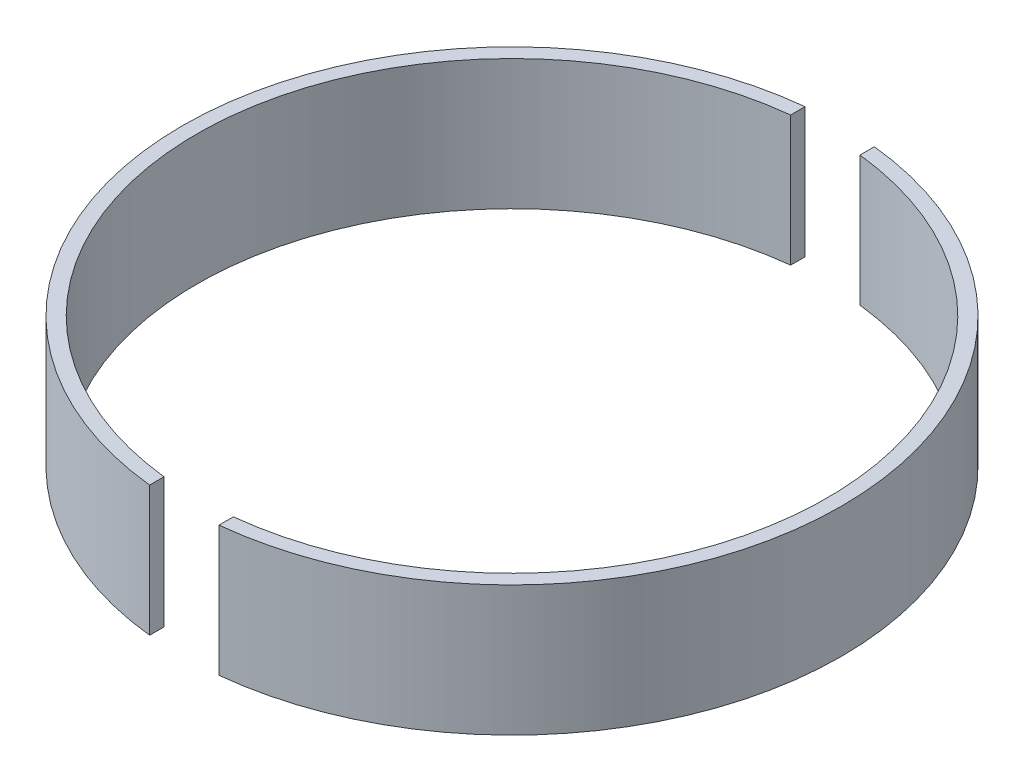
ISO-10303-21;
HEADER;
FILE_DESCRIPTION(('STEP AP214'),'2;1');
FILE_NAME('part.step','',(''),(''),'','','');
FILE_SCHEMA(('AUTOMOTIVE_DESIGN { 1 0 10303 214 1 1 1 1 }'));
ENDSEC;
DATA;
#1=APPLICATION_CONTEXT('core data for automotive mechanical design processes');
#2=APPLICATION_PROTOCOL_DEFINITION('international standard','automotive_design',2000,#1);
#3=PRODUCT_CONTEXT('',#1,'mechanical');
#4=PRODUCT('Part','Part','',(#3));
#5=PRODUCT_RELATED_PRODUCT_CATEGORY('part','',(#4));
#6=PRODUCT_DEFINITION_FORMATION('','',#4);
#7=PRODUCT_DEFINITION_CONTEXT('part definition',#1,'design');
#8=PRODUCT_DEFINITION('design','',#6,#7);
#9=PRODUCT_DEFINITION_SHAPE('','',#8);
#10=(LENGTH_UNIT() NAMED_UNIT(*) SI_UNIT(.MILLI.,.METRE.));
#11=(NAMED_UNIT(*) PLANE_ANGLE_UNIT() SI_UNIT($,.RADIAN.));
#12=(NAMED_UNIT(*) SI_UNIT($,.STERADIAN.) SOLID_ANGLE_UNIT());
#13=UNCERTAINTY_MEASURE_WITH_UNIT(LENGTH_MEASURE(1.E-05),#10,'distance_accuracy_value','');
#14=(GEOMETRIC_REPRESENTATION_CONTEXT(3) GLOBAL_UNCERTAINTY_ASSIGNED_CONTEXT((#13)) GLOBAL_UNIT_ASSIGNED_CONTEXT((#10,
#11,#12)) REPRESENTATION_CONTEXT('',''));
#15=CARTESIAN_POINT('',(0.,0.,0.));
#16=DIRECTION('',(0.,0.,1.));
#17=DIRECTION('',(1.,0.,0.));
#18=AXIS2_PLACEMENT_3D('',#15,#16,#17);
#19=CARTESIAN_POINT('',(0.,30.,0.));
#20=DIRECTION('',(0.,1.,0.));
#21=DIRECTION('',(0.,0.,1.));
#22=AXIS2_PLACEMENT_3D('',#19,#20,#21);
#23=PLANE('',#22);
#24=DIRECTION('',(0.,0.,-1.));
#25=VECTOR('',#24,1.);
#26=CARTESIAN_POINT('',(-7.99999999999997,30.,125.871671964093));
#27=LINE('',#26,#25);
#28=CARTESIAN_POINT('',(-7.99999999999995,30.,-72.2584943103577));
#29=VERTEX_POINT('',#28);
#30=CARTESIAN_POINT('',(-7.99999999999995,30.,-75.5777745107647));
#31=VERTEX_POINT('',#30);
#32=EDGE_CURVE('E80',#29,#31,#27,.T.);
#33=ORIENTED_EDGE('',*,*,#32,.T.);
#34=CARTESIAN_POINT('',(0.,30.,0.));
#35=DIRECTION('',(0.,1.,0.));
#36=DIRECTION('',(0.,0.,1.));
#37=AXIS2_PLACEMENT_3D('',#34,#35,#36);
#38=CIRCLE('',#37,76.);
#39=CARTESIAN_POINT('',(-7.99999999999997,30.,75.5777745107647));
#40=VERTEX_POINT('',#39);
#41=EDGE_CURVE('E108',#31,#40,#38,.T.);
#42=ORIENTED_EDGE('',*,*,#41,.T.);
#43=CARTESIAN_POINT('',(-7.99999999999997,30.,72.2584943103577));
#44=VERTEX_POINT('',#43);
#45=EDGE_CURVE('E90',#40,#44,#27,.T.);
#46=ORIENTED_EDGE('',*,*,#45,.T.);
#47=CARTESIAN_POINT('',(0.,30.,0.));
#48=DIRECTION('',(0.,1.,0.));
#49=DIRECTION('',(0.,0.,1.));
#50=AXIS2_PLACEMENT_3D('',#47,#48,#49);
#51=CIRCLE('',#50,72.7);
#52=EDGE_CURVE('E95',#29,#44,#51,.T.);
#53=ORIENTED_EDGE('',*,*,#52,.F.);
#54=EDGE_LOOP('',(#33,#42,#46,#53));
#55=FACE_BOUND('',#54,.T.);
#56=ADVANCED_FACE('F45',(#55),#23,.T.);
#57=CARTESIAN_POINT('',(0.,0.,0.));
#58=DIRECTION('',(0.,1.,0.));
#59=DIRECTION('',(0.,0.,1.));
#60=AXIS2_PLACEMENT_3D('',#57,#58,#59);
#61=PLANE('',#60);
#62=CARTESIAN_POINT('',(0.,0.,0.));
#63=DIRECTION('',(0.,1.,0.));
#64=DIRECTION('',(0.,0.,1.));
#65=AXIS2_PLACEMENT_3D('',#62,#63,#64);
#66=CIRCLE('',#65,76.);
#67=CARTESIAN_POINT('',(-7.99999999999995,0.,-75.5777745107647));
#68=VERTEX_POINT('',#67);
#69=CARTESIAN_POINT('',(-7.99999999999997,0.,75.5777745107647));
#70=VERTEX_POINT('',#69);
#71=EDGE_CURVE('E96',#68,#70,#66,.T.);
#72=ORIENTED_EDGE('',*,*,#71,.F.);
#73=DIRECTION('',(0.,0.,-1.));
#74=VECTOR('',#73,1.);
#75=CARTESIAN_POINT('',(-7.99999999999997,0.,125.871671964093));
#76=LINE('',#75,#74);
#77=CARTESIAN_POINT('',(-7.99999999999995,0.,-72.2584943103577));
#78=VERTEX_POINT('',#77);
#79=EDGE_CURVE('E12',#78,#68,#76,.T.);
#80=ORIENTED_EDGE('',*,*,#79,.F.);
#81=CARTESIAN_POINT('',(0.,0.,0.));
#82=DIRECTION('',(0.,1.,0.));
#83=DIRECTION('',(0.,0.,1.));
#84=AXIS2_PLACEMENT_3D('',#81,#82,#83);
#85=CIRCLE('',#84,72.7);
#86=CARTESIAN_POINT('',(-7.99999999999997,0.,72.2584943103577));
#87=VERTEX_POINT('',#86);
#88=EDGE_CURVE('E48',#78,#87,#85,.T.);
#89=ORIENTED_EDGE('',*,*,#88,.T.);
#90=EDGE_CURVE('E56',#70,#87,#76,.T.);
#91=ORIENTED_EDGE('',*,*,#90,.F.);
#92=EDGE_LOOP('',(#72,#80,#89,#91));
#93=FACE_BOUND('',#92,.T.);
#94=ADVANCED_FACE('F101',(#93),#61,.F.);
#95=CARTESIAN_POINT('',(0.,30.,0.));
#96=DIRECTION('',(0.,-1.,0.));
#97=DIRECTION('',(0.,0.,-1.));
#98=AXIS2_PLACEMENT_3D('',#95,#96,#97);
#99=CYLINDRICAL_SURFACE('',#98,76.);
#100=ORIENTED_EDGE('',*,*,#41,.F.);
#101=DIRECTION('',(0.,-1.,0.));
#102=VECTOR('',#101,1.);
#103=CARTESIAN_POINT('',(-7.99999999999995,30.,-75.5777745107647));
#104=LINE('',#103,#102);
#105=EDGE_CURVE('E63',#31,#68,#104,.T.);
#106=ORIENTED_EDGE('',*,*,#105,.T.);
#107=ORIENTED_EDGE('',*,*,#71,.T.);
#108=DIRECTION('',(0.,-1.,0.));
#109=VECTOR('',#108,1.);
#110=CARTESIAN_POINT('',(-7.99999999999997,30.,75.5777745107647));
#111=LINE('',#110,#109);
#112=EDGE_CURVE('E85',#70,#40,#111,.F.);
#113=ORIENTED_EDGE('',*,*,#112,.T.);
#114=EDGE_LOOP('',(#100,#106,#107,#113));
#115=FACE_BOUND('',#114,.T.);
#116=ADVANCED_FACE('F104',(#115),#99,.T.);
#117=CARTESIAN_POINT('',(0.,30.,0.));
#118=DIRECTION('',(0.,-1.,0.));
#119=DIRECTION('',(0.,0.,-1.));
#120=AXIS2_PLACEMENT_3D('',#117,#118,#119);
#121=CYLINDRICAL_SURFACE('',#120,72.7);
#122=DIRECTION('',(0.,-1.,0.));
#123=VECTOR('',#122,1.);
#124=CARTESIAN_POINT('',(-7.99999999999995,30.,-72.2584943103577));
#125=LINE('',#124,#123);
#126=EDGE_CURVE('E54',#29,#78,#125,.T.);
#127=ORIENTED_EDGE('',*,*,#126,.F.);
#128=ORIENTED_EDGE('',*,*,#52,.T.);
#129=DIRECTION('',(0.,-1.,0.));
#130=VECTOR('',#129,1.);
#131=CARTESIAN_POINT('',(-7.99999999999997,30.,72.2584943103577));
#132=LINE('',#131,#130);
#133=EDGE_CURVE('E103',#87,#44,#132,.F.);
#134=ORIENTED_EDGE('',*,*,#133,.F.);
#135=ORIENTED_EDGE('',*,*,#88,.F.);
#136=EDGE_LOOP('',(#127,#128,#134,#135));
#137=FACE_BOUND('',#136,.T.);
#138=ADVANCED_FACE('F113',(#137),#121,.F.);
#139=CARTESIAN_POINT('',(-7.99999999999997,30.,125.871671964093));
#140=DIRECTION('',(-1.,0.,0.));
#141=DIRECTION('',(0.,0.,1.));
#142=AXIS2_PLACEMENT_3D('',#139,#140,#141);
#143=PLANE('',#142);
#144=ORIENTED_EDGE('',*,*,#90,.T.);
#145=ORIENTED_EDGE('',*,*,#133,.T.);
#146=ORIENTED_EDGE('',*,*,#45,.F.);
#147=ORIENTED_EDGE('',*,*,#112,.F.);
#148=EDGE_LOOP('',(#144,#145,#146,#147));
#149=FACE_BOUND('',#148,.T.);
#150=ADVANCED_FACE('F87',(#149),#143,.F.);
#151=ORIENTED_EDGE('',*,*,#32,.F.);
#152=ORIENTED_EDGE('',*,*,#126,.T.);
#153=ORIENTED_EDGE('',*,*,#79,.T.);
#154=ORIENTED_EDGE('',*,*,#105,.F.);
#155=EDGE_LOOP('',(#151,#152,#153,#154));
#156=FACE_BOUND('',#155,.T.);
#157=ADVANCED_FACE('F128',(#156),#143,.F.);
#158=CLOSED_SHELL('',(#56,#94,#116,#138,#150,#157));
#159=MANIFOLD_SOLID_BREP('B2',#158);
#160=CARTESIAN_POINT('',(0.,30.,0.));
#161=DIRECTION('',(0.,-1.,0.));
#162=DIRECTION('',(0.,0.,-1.));
#163=AXIS2_PLACEMENT_3D('',#160,#161,#162);
#164=CYLINDRICAL_SURFACE('',#163,72.7);
#165=DIRECTION('',(0.,-1.,0.));
#166=VECTOR('',#165,1.);
#167=CARTESIAN_POINT('',(8.00000000000004,30.,72.2584943103577));
#168=LINE('',#167,#166);
#169=CARTESIAN_POINT('',(8.00000000000004,30.,72.2584943103577));
#170=VERTEX_POINT('',#169);
#171=CARTESIAN_POINT('',(8.00000000000004,0.,72.2584943103577));
#172=VERTEX_POINT('',#171);
#173=EDGE_CURVE('E43',#170,#172,#168,.T.);
#174=ORIENTED_EDGE('',*,*,#173,.F.);
#175=CARTESIAN_POINT('',(0.,30.,0.));
#176=DIRECTION('',(0.,1.,0.));
#177=DIRECTION('',(0.,0.,1.));
#178=AXIS2_PLACEMENT_3D('',#175,#176,#177);
#179=CIRCLE('',#178,72.7);
#180=CARTESIAN_POINT('',(8.00000000000006,30.,-72.2584943103577));
#181=VERTEX_POINT('',#180);
#182=EDGE_CURVE('E226',#170,#181,#179,.T.);
#183=ORIENTED_EDGE('',*,*,#182,.T.);
#184=DIRECTION('',(0.,-1.,0.));
#185=VECTOR('',#184,1.);
#186=CARTESIAN_POINT('',(8.00000000000006,30.,-72.2584943103577));
#187=LINE('',#186,#185);
#188=CARTESIAN_POINT('',(8.00000000000006,0.,-72.2584943103577));
#189=VERTEX_POINT('',#188);
#190=EDGE_CURVE('E174',#189,#181,#187,.F.);
#191=ORIENTED_EDGE('',*,*,#190,.F.);
#192=CARTESIAN_POINT('',(0.,0.,0.));
#193=DIRECTION('',(0.,1.,0.));
#194=DIRECTION('',(0.,0.,1.));
#195=AXIS2_PLACEMENT_3D('',#192,#193,#194);
#196=CIRCLE('',#195,72.7);
#197=EDGE_CURVE('E221',#172,#189,#196,.T.);
#198=ORIENTED_EDGE('',*,*,#197,.F.);
#199=EDGE_LOOP('',(#174,#183,#191,#198));
#200=FACE_BOUND('',#199,.T.);
#201=ADVANCED_FACE('F166',(#200),#164,.F.);
#202=CARTESIAN_POINT('',(0.,30.,0.));
#203=DIRECTION('',(0.,-1.,0.));
#204=DIRECTION('',(0.,0.,-1.));
#205=AXIS2_PLACEMENT_3D('',#202,#203,#204);
#206=CYLINDRICAL_SURFACE('',#205,76.);
#207=CARTESIAN_POINT('',(0.,30.,0.));
#208=DIRECTION('',(0.,1.,0.));
#209=DIRECTION('',(0.,0.,1.));
#210=AXIS2_PLACEMENT_3D('',#207,#208,#209);
#211=CIRCLE('',#210,76.);
#212=CARTESIAN_POINT('',(8.00000000000004,30.,75.5777745107647));
#213=VERTEX_POINT('',#212);
#214=CARTESIAN_POINT('',(8.00000000000006,30.,-75.5777745107647));
#215=VERTEX_POINT('',#214);
#216=EDGE_CURVE('E225',#213,#215,#211,.T.);
#217=ORIENTED_EDGE('',*,*,#216,.F.);
#218=DIRECTION('',(0.,-1.,0.));
#219=VECTOR('',#218,1.);
#220=CARTESIAN_POINT('',(8.00000000000004,30.,75.5777745107647));
#221=LINE('',#220,#219);
#222=CARTESIAN_POINT('',(8.00000000000004,0.,75.5777745107647));
#223=VERTEX_POINT('',#222);
#224=EDGE_CURVE('E212',#213,#223,#221,.T.);
#225=ORIENTED_EDGE('',*,*,#224,.T.);
#226=CARTESIAN_POINT('',(0.,0.,0.));
#227=DIRECTION('',(0.,1.,0.));
#228=DIRECTION('',(0.,0.,1.));
#229=AXIS2_PLACEMENT_3D('',#226,#227,#228);
#230=CIRCLE('',#229,76.);
#231=CARTESIAN_POINT('',(8.00000000000006,0.,-75.5777745107647));
#232=VERTEX_POINT('',#231);
#233=EDGE_CURVE('E219',#223,#232,#230,.T.);
#234=ORIENTED_EDGE('',*,*,#233,.T.);
#235=DIRECTION('',(0.,-1.,0.));
#236=VECTOR('',#235,1.);
#237=CARTESIAN_POINT('',(8.00000000000006,30.,-75.5777745107647));
#238=LINE('',#237,#236);
#239=EDGE_CURVE('E204',#232,#215,#238,.F.);
#240=ORIENTED_EDGE('',*,*,#239,.T.);
#241=EDGE_LOOP('',(#217,#225,#234,#240));
#242=FACE_BOUND('',#241,.T.);
#243=ADVANCED_FACE('F168',(#242),#206,.T.);
#244=CARTESIAN_POINT('',(0.,0.,0.));
#245=DIRECTION('',(0.,1.,0.));
#246=DIRECTION('',(0.,0.,1.));
#247=AXIS2_PLACEMENT_3D('',#244,#245,#246);
#248=PLANE('',#247);
#249=ORIENTED_EDGE('',*,*,#233,.F.);
#250=DIRECTION('',(0.,0.,1.));
#251=VECTOR('',#250,1.);
#252=CARTESIAN_POINT('',(8.00000000000004,0.,125.871671964093));
#253=LINE('',#252,#251);
#254=EDGE_CURVE('E222',#172,#223,#253,.T.);
#255=ORIENTED_EDGE('',*,*,#254,.F.);
#256=ORIENTED_EDGE('',*,*,#197,.T.);
#257=EDGE_CURVE('E181',#232,#189,#253,.T.);
#258=ORIENTED_EDGE('',*,*,#257,.F.);
#259=EDGE_LOOP('',(#249,#255,#256,#258));
#260=FACE_BOUND('',#259,.T.);
#261=ADVANCED_FACE('F217',(#260),#248,.F.);
#262=CARTESIAN_POINT('',(0.,30.,0.));
#263=DIRECTION('',(0.,1.,0.));
#264=DIRECTION('',(0.,0.,1.));
#265=AXIS2_PLACEMENT_3D('',#262,#263,#264);
#266=PLANE('',#265);
#267=DIRECTION('',(0.,0.,1.));
#268=VECTOR('',#267,1.);
#269=CARTESIAN_POINT('',(8.00000000000004,30.,125.871671964093));
#270=LINE('',#269,#268);
#271=EDGE_CURVE('E188',#170,#213,#270,.T.);
#272=ORIENTED_EDGE('',*,*,#271,.T.);
#273=ORIENTED_EDGE('',*,*,#216,.T.);
#274=EDGE_CURVE('E207',#215,#181,#270,.T.);
#275=ORIENTED_EDGE('',*,*,#274,.T.);
#276=ORIENTED_EDGE('',*,*,#182,.F.);
#277=EDGE_LOOP('',(#272,#273,#275,#276));
#278=FACE_BOUND('',#277,.T.);
#279=ADVANCED_FACE('F235',(#278),#266,.T.);
#280=CARTESIAN_POINT('',(8.00000000000004,30.,125.871671964093));
#281=DIRECTION('',(1.,0.,0.));
#282=DIRECTION('',(0.,0.,-1.));
#283=AXIS2_PLACEMENT_3D('',#280,#281,#282);
#284=PLANE('',#283);
#285=ORIENTED_EDGE('',*,*,#257,.T.);
#286=ORIENTED_EDGE('',*,*,#190,.T.);
#287=ORIENTED_EDGE('',*,*,#274,.F.);
#288=ORIENTED_EDGE('',*,*,#239,.F.);
#289=EDGE_LOOP('',(#285,#286,#287,#288));
#290=FACE_BOUND('',#289,.T.);
#291=ADVANCED_FACE('F205',(#290),#284,.F.);
#292=ORIENTED_EDGE('',*,*,#271,.F.);
#293=ORIENTED_EDGE('',*,*,#173,.T.);
#294=ORIENTED_EDGE('',*,*,#254,.T.);
#295=ORIENTED_EDGE('',*,*,#224,.F.);
#296=EDGE_LOOP('',(#292,#293,#294,#295));
#297=FACE_BOUND('',#296,.T.);
#298=ADVANCED_FACE('F237',(#297),#284,.F.);
#299=CLOSED_SHELL('',(#201,#243,#261,#279,#291,#298));
#300=MANIFOLD_SOLID_BREP('B6',#299);
#301=ADVANCED_BREP_SHAPE_REPRESENTATION('',(#18,#159,#300),#14);
#302=SHAPE_DEFINITION_REPRESENTATION(#9,#301);
ENDSEC;
END-ISO-10303-21;
